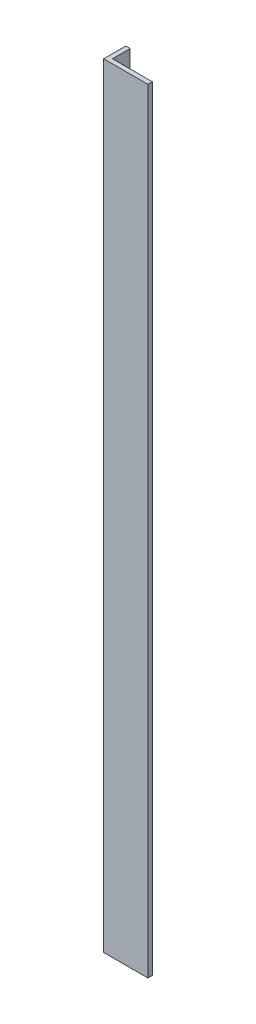
ISO-10303-21;
HEADER;
FILE_DESCRIPTION(('STEP AP214'),'2;1');
FILE_NAME('part.step','',(''),(''),'','','');
FILE_SCHEMA(('AUTOMOTIVE_DESIGN { 1 0 10303 214 1 1 1 1 }'));
ENDSEC;
DATA;
#1=APPLICATION_CONTEXT('core data for automotive mechanical design processes');
#2=APPLICATION_PROTOCOL_DEFINITION('international standard','automotive_design',2000,#1);
#3=PRODUCT_CONTEXT('',#1,'mechanical');
#4=PRODUCT('Part','Part','',(#3));
#5=PRODUCT_RELATED_PRODUCT_CATEGORY('part','',(#4));
#6=PRODUCT_DEFINITION_FORMATION('','',#4);
#7=PRODUCT_DEFINITION_CONTEXT('part definition',#1,'design');
#8=PRODUCT_DEFINITION('design','',#6,#7);
#9=PRODUCT_DEFINITION_SHAPE('','',#8);
#10=(LENGTH_UNIT() NAMED_UNIT(*) SI_UNIT(.MILLI.,.METRE.));
#11=(NAMED_UNIT(*) PLANE_ANGLE_UNIT() SI_UNIT($,.RADIAN.));
#12=(NAMED_UNIT(*) SI_UNIT($,.STERADIAN.) SOLID_ANGLE_UNIT());
#13=UNCERTAINTY_MEASURE_WITH_UNIT(LENGTH_MEASURE(1.E-05),#10,'distance_accuracy_value','');
#14=(GEOMETRIC_REPRESENTATION_CONTEXT(3) GLOBAL_UNCERTAINTY_ASSIGNED_CONTEXT((#13)) GLOBAL_UNIT_ASSIGNED_CONTEXT((#10,
#11,#12)) REPRESENTATION_CONTEXT('',''));
#15=CARTESIAN_POINT('',(0.,0.,0.));
#16=DIRECTION('',(0.,0.,1.));
#17=DIRECTION('',(1.,0.,0.));
#18=AXIS2_PLACEMENT_3D('',#15,#16,#17);
#19=CARTESIAN_POINT('',(0.,0.,0.));
#20=DIRECTION('',(0.,-1.,0.));
#21=DIRECTION('',(0.,0.,-1.));
#22=AXIS2_PLACEMENT_3D('',#19,#20,#21);
#23=PLANE('',#22);
#24=DIRECTION('',(1.,0.,0.));
#25=VECTOR('',#24,1.);
#26=CARTESIAN_POINT('',(20.,0.,0.));
#27=LINE('',#26,#25);
#28=CARTESIAN_POINT('',(0.,0.,0.));
#29=VERTEX_POINT('',#28);
#30=CARTESIAN_POINT('',(20.,0.,0.));
#31=VERTEX_POINT('',#30);
#32=EDGE_CURVE('E102',#29,#31,#27,.T.);
#33=ORIENTED_EDGE('',*,*,#32,.F.);
#34=DIRECTION('',(0.,0.,1.));
#35=VECTOR('',#34,1.);
#36=CARTESIAN_POINT('',(0.,0.,0.));
#37=LINE('',#36,#35);
#38=CARTESIAN_POINT('',(0.,0.,-10.));
#39=VERTEX_POINT('',#38);
#40=EDGE_CURVE('E125',#39,#29,#37,.T.);
#41=ORIENTED_EDGE('',*,*,#40,.F.);
#42=DIRECTION('',(-1.,0.,0.));
#43=VECTOR('',#42,1.);
#44=CARTESIAN_POINT('',(0.,0.,-10.));
#45=LINE('',#44,#43);
#46=CARTESIAN_POINT('',(2.,0.,-10.));
#47=VERTEX_POINT('',#46);
#48=EDGE_CURVE('E122',#47,#39,#45,.T.);
#49=ORIENTED_EDGE('',*,*,#48,.F.);
#50=DIRECTION('',(0.,0.,-1.));
#51=VECTOR('',#50,1.);
#52=CARTESIAN_POINT('',(2.,0.,-10.));
#53=LINE('',#52,#51);
#54=CARTESIAN_POINT('',(2.,0.,-2.));
#55=VERTEX_POINT('',#54);
#56=EDGE_CURVE('E119',#55,#47,#53,.T.);
#57=ORIENTED_EDGE('',*,*,#56,.F.);
#58=DIRECTION('',(-1.,0.,0.));
#59=VECTOR('',#58,1.);
#60=CARTESIAN_POINT('',(2.,0.,-2.));
#61=LINE('',#60,#59);
#62=CARTESIAN_POINT('',(20.,0.,-2.));
#63=VERTEX_POINT('',#62);
#64=EDGE_CURVE('E105',#63,#55,#61,.T.);
#65=ORIENTED_EDGE('',*,*,#64,.F.);
#66=DIRECTION('',(0.,0.,-1.));
#67=VECTOR('',#66,1.);
#68=CARTESIAN_POINT('',(20.,0.,-2.));
#69=LINE('',#68,#67);
#70=EDGE_CURVE('E92',#31,#63,#69,.T.);
#71=ORIENTED_EDGE('',*,*,#70,.F.);
#72=EDGE_LOOP('',(#33,#41,#49,#57,#65,#71));
#73=FACE_BOUND('',#72,.T.);
#74=ADVANCED_FACE('F35',(#73),#23,.T.);
#75=CARTESIAN_POINT('',(0.,372.360679774998,0.));
#76=DIRECTION('',(1.,0.,0.));
#77=DIRECTION('',(0.,0.,-1.));
#78=AXIS2_PLACEMENT_3D('',#75,#76,#77);
#79=PLANE('',#78);
#80=CARTESIAN_POINT('',(0.,5.99999999999994,-5.65685424949286));
#81=DIRECTION('',(-1.,0.,0.));
#82=DIRECTION('',(0.,0.,1.));
#83=AXIS2_PLACEMENT_3D('',#80,#81,#82);
#84=CIRCLE('',#83,1.49999999999999);
#85=CARTESIAN_POINT('',(0.,5.99999999999994,-4.15685424949287));
#86=VERTEX_POINT('',#85);
#87=EDGE_CURVE('E201',#86,#86,#84,.T.);
#88=ORIENTED_EDGE('',*,*,#87,.F.);
#89=EDGE_LOOP('',(#88));
#90=FACE_BOUND('',#89,.T.);
#91=CARTESIAN_POINT('',(0.,19.9957940465657,-6.00000000003256));
#92=DIRECTION('',(-1.,0.,0.));
#93=DIRECTION('',(0.,0.,1.));
#94=AXIS2_PLACEMENT_3D('',#91,#92,#93);
#95=CIRCLE('',#94,1.49999999999999);
#96=CARTESIAN_POINT('',(0.,19.9957940465657,-4.50000000003257));
#97=VERTEX_POINT('',#96);
#98=EDGE_CURVE('E203',#97,#97,#95,.T.);
#99=ORIENTED_EDGE('',*,*,#98,.F.);
#100=EDGE_LOOP('',(#99));
#101=FACE_BOUND('',#100,.T.);
#102=CARTESIAN_POINT('',(0.,330.,-6.00000000000001));
#103=DIRECTION('',(-1.,0.,0.));
#104=DIRECTION('',(0.,0.,1.));
#105=AXIS2_PLACEMENT_3D('',#102,#103,#104);
#106=CIRCLE('',#105,1.5);
#107=CARTESIAN_POINT('',(0.,330.,-4.5));
#108=VERTEX_POINT('',#107);
#109=EDGE_CURVE('E211',#108,#108,#106,.T.);
#110=ORIENTED_EDGE('',*,*,#109,.F.);
#111=EDGE_LOOP('',(#110));
#112=FACE_BOUND('',#111,.T.);
#113=CARTESIAN_POINT('',(0.,344.,-6.00000000000001));
#114=DIRECTION('',(-1.,0.,0.));
#115=DIRECTION('',(0.,0.,1.));
#116=AXIS2_PLACEMENT_3D('',#113,#114,#115);
#117=CIRCLE('',#116,1.5);
#118=CARTESIAN_POINT('',(0.,344.,-4.5));
#119=VERTEX_POINT('',#118);
#120=EDGE_CURVE('E113',#119,#119,#117,.T.);
#121=ORIENTED_EDGE('',*,*,#120,.F.);
#122=EDGE_LOOP('',(#121));
#123=FACE_BOUND('',#122,.T.);
#124=DIRECTION('',(0.,-1.,0.));
#125=VECTOR('',#124,1.);
#126=CARTESIAN_POINT('',(0.,372.360679774998,0.));
#127=LINE('',#126,#125);
#128=CARTESIAN_POINT('',(2.51534904016637E-13,350.,-3.21444260098502E-11));
#129=VERTEX_POINT('',#128);
#130=EDGE_CURVE('E108',#129,#29,#127,.T.);
#131=ORIENTED_EDGE('',*,*,#130,.F.);
#132=DIRECTION('',(0.,0.,-1.));
#133=VECTOR('',#132,1.);
#134=CARTESIAN_POINT('',(0.,350.,0.));
#135=LINE('',#134,#133);
#136=CARTESIAN_POINT('',(0.,350.,-10.));
#137=VERTEX_POINT('',#136);
#138=EDGE_CURVE('E96',#129,#137,#135,.T.);
#139=ORIENTED_EDGE('',*,*,#138,.T.);
#140=DIRECTION('',(0.,-1.,0.));
#141=VECTOR('',#140,1.);
#142=CARTESIAN_POINT('',(0.,372.360679774998,-10.));
#143=LINE('',#142,#141);
#144=EDGE_CURVE('E128',#137,#39,#143,.T.);
#145=ORIENTED_EDGE('',*,*,#144,.T.);
#146=ORIENTED_EDGE('',*,*,#40,.T.);
#147=EDGE_LOOP('',(#131,#139,#145,#146));
#148=FACE_BOUND('',#147,.T.);
#149=ADVANCED_FACE('F149',(#90,#101,#112,#123,#148),#79,.F.);
#150=CARTESIAN_POINT('',(0.,372.360679774998,-10.));
#151=DIRECTION('',(0.,0.,1.));
#152=DIRECTION('',(1.,0.,0.));
#153=AXIS2_PLACEMENT_3D('',#150,#151,#152);
#154=PLANE('',#153);
#155=ORIENTED_EDGE('',*,*,#144,.F.);
#156=DIRECTION('',(1.,0.,0.));
#157=VECTOR('',#156,1.);
#158=CARTESIAN_POINT('',(0.,350.,-10.));
#159=LINE('',#158,#157);
#160=CARTESIAN_POINT('',(2.,350.,-10.));
#161=VERTEX_POINT('',#160);
#162=EDGE_CURVE('E135',#137,#161,#159,.T.);
#163=ORIENTED_EDGE('',*,*,#162,.T.);
#164=DIRECTION('',(0.,-1.,0.));
#165=VECTOR('',#164,1.);
#166=CARTESIAN_POINT('',(2.,372.360679774998,-10.));
#167=LINE('',#166,#165);
#168=EDGE_CURVE('E130',#161,#47,#167,.T.);
#169=ORIENTED_EDGE('',*,*,#168,.T.);
#170=ORIENTED_EDGE('',*,*,#48,.T.);
#171=EDGE_LOOP('',(#155,#163,#169,#170));
#172=FACE_BOUND('',#171,.T.);
#173=ADVANCED_FACE('F148',(#172),#154,.F.);
#174=CARTESIAN_POINT('',(2.,372.360679774998,-10.));
#175=DIRECTION('',(-1.,0.,0.));
#176=DIRECTION('',(0.,0.,1.));
#177=AXIS2_PLACEMENT_3D('',#174,#175,#176);
#178=PLANE('',#177);
#179=CARTESIAN_POINT('',(2.,5.99999999999994,-5.65685424949286));
#180=DIRECTION('',(-1.,0.,0.));
#181=DIRECTION('',(0.,0.,1.));
#182=AXIS2_PLACEMENT_3D('',#179,#180,#181);
#183=CIRCLE('',#182,1.49999999999999);
#184=CARTESIAN_POINT('',(2.,5.99999999999994,-4.15685424949287));
#185=VERTEX_POINT('',#184);
#186=EDGE_CURVE('E199',#185,#185,#183,.T.);
#187=ORIENTED_EDGE('',*,*,#186,.T.);
#188=EDGE_LOOP('',(#187));
#189=FACE_BOUND('',#188,.T.);
#190=CARTESIAN_POINT('',(2.,19.9957940465657,-6.00000000003256));
#191=DIRECTION('',(-1.,0.,0.));
#192=DIRECTION('',(0.,0.,1.));
#193=AXIS2_PLACEMENT_3D('',#190,#191,#192);
#194=CIRCLE('',#193,1.49999999999999);
#195=CARTESIAN_POINT('',(2.,19.9957940465657,-4.50000000003257));
#196=VERTEX_POINT('',#195);
#197=EDGE_CURVE('E208',#196,#196,#194,.T.);
#198=ORIENTED_EDGE('',*,*,#197,.T.);
#199=EDGE_LOOP('',(#198));
#200=FACE_BOUND('',#199,.T.);
#201=CARTESIAN_POINT('',(2.,330.,-6.00000000000001));
#202=DIRECTION('',(-1.,0.,0.));
#203=DIRECTION('',(0.,0.,1.));
#204=AXIS2_PLACEMENT_3D('',#201,#202,#203);
#205=CIRCLE('',#204,1.5);
#206=CARTESIAN_POINT('',(2.,330.,-4.5));
#207=VERTEX_POINT('',#206);
#208=EDGE_CURVE('E214',#207,#207,#205,.T.);
#209=ORIENTED_EDGE('',*,*,#208,.T.);
#210=EDGE_LOOP('',(#209));
#211=FACE_BOUND('',#210,.T.);
#212=CARTESIAN_POINT('',(2.,344.,-6.00000000000001));
#213=DIRECTION('',(-1.,0.,0.));
#214=DIRECTION('',(0.,0.,1.));
#215=AXIS2_PLACEMENT_3D('',#212,#213,#214);
#216=CIRCLE('',#215,1.5);
#217=CARTESIAN_POINT('',(2.,344.,-4.5));
#218=VERTEX_POINT('',#217);
#219=EDGE_CURVE('E110',#218,#218,#216,.T.);
#220=ORIENTED_EDGE('',*,*,#219,.T.);
#221=EDGE_LOOP('',(#220));
#222=FACE_BOUND('',#221,.T.);
#223=ORIENTED_EDGE('',*,*,#168,.F.);
#224=DIRECTION('',(0.,0.,1.));
#225=VECTOR('',#224,1.);
#226=CARTESIAN_POINT('',(2.,350.,-10.));
#227=LINE('',#226,#225);
#228=CARTESIAN_POINT('',(2.,350.,-2.));
#229=VERTEX_POINT('',#228);
#230=EDGE_CURVE('E55',#161,#229,#227,.T.);
#231=ORIENTED_EDGE('',*,*,#230,.T.);
#232=DIRECTION('',(0.,-1.,0.));
#233=VECTOR('',#232,1.);
#234=CARTESIAN_POINT('',(2.,372.360679774998,-2.));
#235=LINE('',#234,#233);
#236=EDGE_CURVE('E132',#229,#55,#235,.T.);
#237=ORIENTED_EDGE('',*,*,#236,.T.);
#238=ORIENTED_EDGE('',*,*,#56,.T.);
#239=EDGE_LOOP('',(#223,#231,#237,#238));
#240=FACE_BOUND('',#239,.T.);
#241=ADVANCED_FACE('F146',(#189,#200,#211,#222,#240),#178,.F.);
#242=CARTESIAN_POINT('',(2.,372.360679774998,-2.));
#243=DIRECTION('',(0.,0.,1.));
#244=DIRECTION('',(1.,0.,0.));
#245=AXIS2_PLACEMENT_3D('',#242,#243,#244);
#246=PLANE('',#245);
#247=ORIENTED_EDGE('',*,*,#236,.F.);
#248=DIRECTION('',(1.,0.,0.));
#249=VECTOR('',#248,1.);
#250=CARTESIAN_POINT('',(2.00000000000001,350.,-2.));
#251=LINE('',#250,#249);
#252=CARTESIAN_POINT('',(20.,350.,-2.));
#253=VERTEX_POINT('',#252);
#254=EDGE_CURVE('E50',#229,#253,#251,.T.);
#255=ORIENTED_EDGE('',*,*,#254,.T.);
#256=DIRECTION('',(0.,-1.,0.));
#257=VECTOR('',#256,1.);
#258=CARTESIAN_POINT('',(20.,372.360679774998,-2.));
#259=LINE('',#258,#257);
#260=EDGE_CURVE('E97',#253,#63,#259,.T.);
#261=ORIENTED_EDGE('',*,*,#260,.T.);
#262=ORIENTED_EDGE('',*,*,#64,.T.);
#263=EDGE_LOOP('',(#247,#255,#261,#262));
#264=FACE_BOUND('',#263,.T.);
#265=ADVANCED_FACE('F144',(#264),#246,.F.);
#266=CARTESIAN_POINT('',(20.,372.360679774998,-2.));
#267=DIRECTION('',(-1.,0.,0.));
#268=DIRECTION('',(0.,0.,1.));
#269=AXIS2_PLACEMENT_3D('',#266,#267,#268);
#270=PLANE('',#269);
#271=ORIENTED_EDGE('',*,*,#260,.F.);
#272=DIRECTION('',(0.,0.,1.));
#273=VECTOR('',#272,1.);
#274=CARTESIAN_POINT('',(20.,350.,-2.00000000000001));
#275=LINE('',#274,#273);
#276=CARTESIAN_POINT('',(20.,350.,-3.21426219841358E-11));
#277=VERTEX_POINT('',#276);
#278=EDGE_CURVE('E43',#253,#277,#275,.T.);
#279=ORIENTED_EDGE('',*,*,#278,.T.);
#280=DIRECTION('',(0.,-1.,0.));
#281=VECTOR('',#280,1.);
#282=CARTESIAN_POINT('',(20.,372.360679774998,0.));
#283=LINE('',#282,#281);
#284=EDGE_CURVE('E88',#277,#31,#283,.T.);
#285=ORIENTED_EDGE('',*,*,#284,.T.);
#286=ORIENTED_EDGE('',*,*,#70,.T.);
#287=EDGE_LOOP('',(#271,#279,#285,#286));
#288=FACE_BOUND('',#287,.T.);
#289=ADVANCED_FACE('F91',(#288),#270,.F.);
#290=CARTESIAN_POINT('',(20.,372.360679774998,0.));
#291=DIRECTION('',(0.,0.,-1.));
#292=DIRECTION('',(-1.,0.,0.));
#293=AXIS2_PLACEMENT_3D('',#290,#291,#292);
#294=PLANE('',#293);
#295=ORIENTED_EDGE('',*,*,#284,.F.);
#296=DIRECTION('',(-1.,0.,0.));
#297=VECTOR('',#296,1.);
#298=CARTESIAN_POINT('',(20.,350.,0.));
#299=LINE('',#298,#297);
#300=EDGE_CURVE('E11',#277,#129,#299,.T.);
#301=ORIENTED_EDGE('',*,*,#300,.T.);
#302=ORIENTED_EDGE('',*,*,#130,.T.);
#303=ORIENTED_EDGE('',*,*,#32,.T.);
#304=EDGE_LOOP('',(#295,#301,#302,#303));
#305=FACE_BOUND('',#304,.T.);
#306=ADVANCED_FACE('F37',(#305),#294,.F.);
#307=CARTESIAN_POINT('',(2.51534904016637E-13,350.,-3.21444260098502E-11));
#308=DIRECTION('',(0.,-1.,0.));
#309=DIRECTION('',(0.,0.,-1.));
#310=AXIS2_PLACEMENT_3D('',#307,#308,#309);
#311=PLANE('',#310);
#312=ORIENTED_EDGE('',*,*,#254,.F.);
#313=ORIENTED_EDGE('',*,*,#230,.F.);
#314=ORIENTED_EDGE('',*,*,#162,.F.);
#315=ORIENTED_EDGE('',*,*,#138,.F.);
#316=ORIENTED_EDGE('',*,*,#300,.F.);
#317=ORIENTED_EDGE('',*,*,#278,.F.);
#318=EDGE_LOOP('',(#312,#313,#314,#315,#316,#317));
#319=FACE_BOUND('',#318,.T.);
#320=ADVANCED_FACE('F171',(#319),#311,.F.);
#321=CARTESIAN_POINT('',(0.,344.,-6.00000000000001));
#322=DIRECTION('',(-1.,0.,0.));
#323=DIRECTION('',(0.,0.,1.));
#324=AXIS2_PLACEMENT_3D('',#321,#322,#323);
#325=CYLINDRICAL_SURFACE('',#324,1.5);
#326=ORIENTED_EDGE('',*,*,#219,.F.);
#327=EDGE_LOOP('',(#326));
#328=FACE_BOUND('',#327,.T.);
#329=ORIENTED_EDGE('',*,*,#120,.T.);
#330=EDGE_LOOP('',(#329));
#331=FACE_BOUND('',#330,.T.);
#332=ADVANCED_FACE('F176',(#328,#331),#325,.F.);
#333=CARTESIAN_POINT('',(0.,330.,-6.00000000000001));
#334=DIRECTION('',(-1.,0.,0.));
#335=DIRECTION('',(0.,0.,1.));
#336=AXIS2_PLACEMENT_3D('',#333,#334,#335);
#337=CYLINDRICAL_SURFACE('',#336,1.5);
#338=ORIENTED_EDGE('',*,*,#208,.F.);
#339=EDGE_LOOP('',(#338));
#340=FACE_BOUND('',#339,.T.);
#341=ORIENTED_EDGE('',*,*,#109,.T.);
#342=EDGE_LOOP('',(#341));
#343=FACE_BOUND('',#342,.T.);
#344=ADVANCED_FACE('F180',(#340,#343),#337,.F.);
#345=CARTESIAN_POINT('',(0.,19.9957940465657,-6.00000000003256));
#346=DIRECTION('',(-1.,0.,0.));
#347=DIRECTION('',(0.,0.,1.));
#348=AXIS2_PLACEMENT_3D('',#345,#346,#347);
#349=CYLINDRICAL_SURFACE('',#348,1.49999999999999);
#350=ORIENTED_EDGE('',*,*,#197,.F.);
#351=EDGE_LOOP('',(#350));
#352=FACE_BOUND('',#351,.T.);
#353=ORIENTED_EDGE('',*,*,#98,.T.);
#354=EDGE_LOOP('',(#353));
#355=FACE_BOUND('',#354,.T.);
#356=ADVANCED_FACE('F186',(#352,#355),#349,.F.);
#357=CARTESIAN_POINT('',(0.,5.99999999999994,-5.65685424949286));
#358=DIRECTION('',(-1.,0.,0.));
#359=DIRECTION('',(0.,0.,1.));
#360=AXIS2_PLACEMENT_3D('',#357,#358,#359);
#361=CYLINDRICAL_SURFACE('',#360,1.49999999999999);
#362=ORIENTED_EDGE('',*,*,#186,.F.);
#363=EDGE_LOOP('',(#362));
#364=FACE_BOUND('',#363,.T.);
#365=ORIENTED_EDGE('',*,*,#87,.T.);
#366=EDGE_LOOP('',(#365));
#367=FACE_BOUND('',#366,.T.);
#368=ADVANCED_FACE('F190',(#364,#367),#361,.F.);
#369=CLOSED_SHELL('',(#74,#149,#173,#241,#265,#289,#306,#320,#332,#344,#356,#368));
#370=MANIFOLD_SOLID_BREP('B2',#369);
#371=ADVANCED_BREP_SHAPE_REPRESENTATION('',(#18,#370),#14);
#372=SHAPE_DEFINITION_REPRESENTATION(#9,#371);
ENDSEC;
END-ISO-10303-21;
